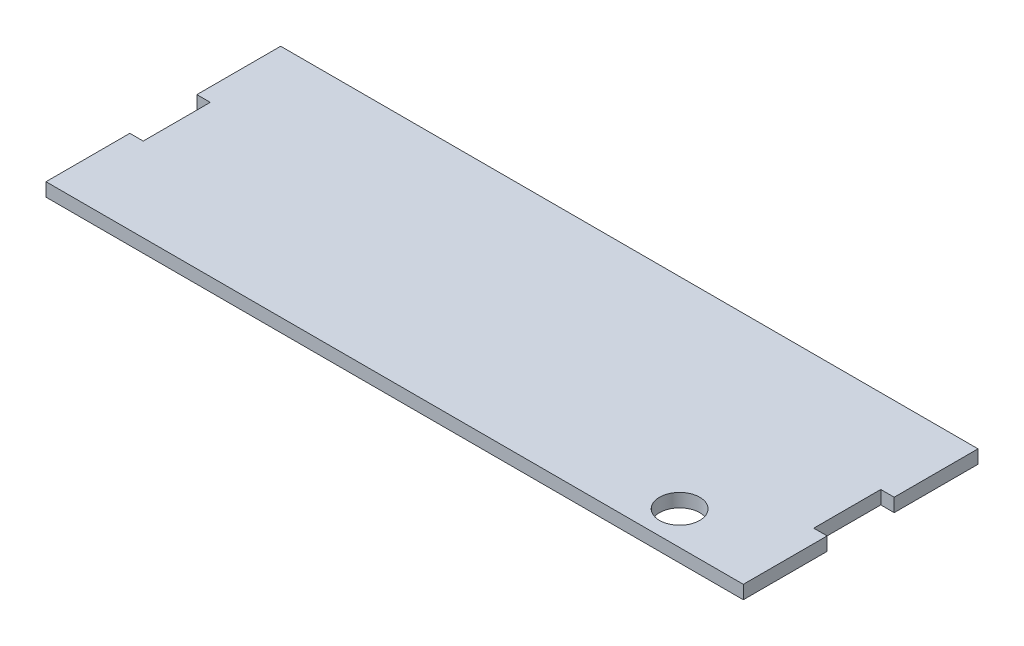
ISO-10303-21;
HEADER;
FILE_DESCRIPTION(('STEP AP214'),'2;1');
FILE_NAME('part.step','',(''),(''),'','','');
FILE_SCHEMA(('AUTOMOTIVE_DESIGN { 1 0 10303 214 1 1 1 1 }'));
ENDSEC;
DATA;
#1=APPLICATION_CONTEXT('core data for automotive mechanical design processes');
#2=APPLICATION_PROTOCOL_DEFINITION('international standard','automotive_design',2000,#1);
#3=PRODUCT_CONTEXT('',#1,'mechanical');
#4=PRODUCT('Part','Part','',(#3));
#5=PRODUCT_RELATED_PRODUCT_CATEGORY('part','',(#4));
#6=PRODUCT_DEFINITION_FORMATION('','',#4);
#7=PRODUCT_DEFINITION_CONTEXT('part definition',#1,'design');
#8=PRODUCT_DEFINITION('design','',#6,#7);
#9=PRODUCT_DEFINITION_SHAPE('','',#8);
#10=(LENGTH_UNIT() NAMED_UNIT(*) SI_UNIT(.MILLI.,.METRE.));
#11=(NAMED_UNIT(*) PLANE_ANGLE_UNIT() SI_UNIT($,.RADIAN.));
#12=(NAMED_UNIT(*) SI_UNIT($,.STERADIAN.) SOLID_ANGLE_UNIT());
#13=UNCERTAINTY_MEASURE_WITH_UNIT(LENGTH_MEASURE(1.E-05),#10,'distance_accuracy_value','');
#14=(GEOMETRIC_REPRESENTATION_CONTEXT(3) GLOBAL_UNCERTAINTY_ASSIGNED_CONTEXT((#13)) GLOBAL_UNIT_ASSIGNED_CONTEXT((#10,
#11,#12)) REPRESENTATION_CONTEXT('',''));
#15=CARTESIAN_POINT('',(0.,0.,0.));
#16=DIRECTION('',(0.,0.,1.));
#17=DIRECTION('',(1.,0.,0.));
#18=AXIS2_PLACEMENT_3D('',#15,#16,#17);
#19=CARTESIAN_POINT('',(-70.8435595970924,4.,0.));
#20=DIRECTION('',(0.,0.,-1.));
#21=DIRECTION('',(-1.,0.,0.));
#22=AXIS2_PLACEMENT_3D('',#19,#20,#21);
#23=PLANE('',#22);
#24=DIRECTION('',(1.,0.,0.));
#25=VECTOR('',#24,1.);
#26=CARTESIAN_POINT('',(-70.8435595970924,0.,0.));
#27=LINE('',#26,#25);
#28=CARTESIAN_POINT('',(-4.,0.,0.));
#29=VERTEX_POINT('',#28);
#30=CARTESIAN_POINT('',(204.,0.,0.));
#31=VERTEX_POINT('',#30);
#32=EDGE_CURVE('E160',#29,#31,#27,.T.);
#33=ORIENTED_EDGE('',*,*,#32,.T.);
#34=DIRECTION('',(0.,-1.,0.));
#35=VECTOR('',#34,1.);
#36=CARTESIAN_POINT('',(204.,4.,0.));
#37=LINE('',#36,#35);
#38=CARTESIAN_POINT('',(204.,4.,0.));
#39=VERTEX_POINT('',#38);
#40=EDGE_CURVE('E11',#39,#31,#37,.T.);
#41=ORIENTED_EDGE('',*,*,#40,.F.);
#42=DIRECTION('',(1.,0.,0.));
#43=VECTOR('',#42,1.);
#44=CARTESIAN_POINT('',(-70.8435595970924,4.,0.));
#45=LINE('',#44,#43);
#46=CARTESIAN_POINT('',(-4.,4.,0.));
#47=VERTEX_POINT('',#46);
#48=EDGE_CURVE('E426',#47,#39,#45,.T.);
#49=ORIENTED_EDGE('',*,*,#48,.F.);
#50=DIRECTION('',(0.,-1.,0.));
#51=VECTOR('',#50,1.);
#52=CARTESIAN_POINT('',(-4.,4.,0.));
#53=LINE('',#52,#51);
#54=EDGE_CURVE('E51',#47,#29,#53,.T.);
#55=ORIENTED_EDGE('',*,*,#54,.T.);
#56=EDGE_LOOP('',(#33,#41,#49,#55));
#57=FACE_BOUND('',#56,.T.);
#58=ADVANCED_FACE('F34',(#57),#23,.F.);
#59=CARTESIAN_POINT('',(204.,4.,-35.));
#60=DIRECTION('',(-1.,0.,0.));
#61=DIRECTION('',(0.,0.,1.));
#62=AXIS2_PLACEMENT_3D('',#59,#60,#61);
#63=PLANE('',#62);
#64=DIRECTION('',(0.,0.,-1.));
#65=VECTOR('',#64,1.);
#66=CARTESIAN_POINT('',(204.,0.,-35.));
#67=LINE('',#66,#65);
#68=CARTESIAN_POINT('',(204.,0.,-25.));
#69=VERTEX_POINT('',#68);
#70=EDGE_CURVE('E162',#31,#69,#67,.T.);
#71=ORIENTED_EDGE('',*,*,#70,.T.);
#72=DIRECTION('',(0.,-1.,0.));
#73=VECTOR('',#72,1.);
#74=CARTESIAN_POINT('',(204.,4.,-25.));
#75=LINE('',#74,#73);
#76=CARTESIAN_POINT('',(204.,4.,-25.));
#77=VERTEX_POINT('',#76);
#78=EDGE_CURVE('E43',#77,#69,#75,.T.);
#79=ORIENTED_EDGE('',*,*,#78,.F.);
#80=DIRECTION('',(0.,0.,-1.));
#81=VECTOR('',#80,1.);
#82=CARTESIAN_POINT('',(204.,4.,-35.));
#83=LINE('',#82,#81);
#84=EDGE_CURVE('E102',#39,#77,#83,.T.);
#85=ORIENTED_EDGE('',*,*,#84,.F.);
#86=ORIENTED_EDGE('',*,*,#40,.T.);
#87=EDGE_LOOP('',(#71,#79,#85,#86));
#88=FACE_BOUND('',#87,.T.);
#89=ADVANCED_FACE('F213',(#88),#63,.F.);
#90=CARTESIAN_POINT('',(-70.8435595970924,4.,-25.));
#91=DIRECTION('',(0.,0.,-1.));
#92=DIRECTION('',(-1.,0.,0.));
#93=AXIS2_PLACEMENT_3D('',#90,#91,#92);
#94=PLANE('',#93);
#95=DIRECTION('',(1.,0.,0.));
#96=VECTOR('',#95,1.);
#97=CARTESIAN_POINT('',(-70.8435595970924,0.,-25.));
#98=LINE('',#97,#96);
#99=CARTESIAN_POINT('',(200.,0.,-25.));
#100=VERTEX_POINT('',#99);
#101=EDGE_CURVE('E165',#100,#69,#98,.T.);
#102=ORIENTED_EDGE('',*,*,#101,.F.);
#103=DIRECTION('',(0.,-1.,0.));
#104=VECTOR('',#103,1.);
#105=CARTESIAN_POINT('',(200.,4.,-25.));
#106=LINE('',#105,#104);
#107=CARTESIAN_POINT('',(200.,4.,-25.));
#108=VERTEX_POINT('',#107);
#109=EDGE_CURVE('E206',#108,#100,#106,.T.);
#110=ORIENTED_EDGE('',*,*,#109,.F.);
#111=DIRECTION('',(1.,0.,0.));
#112=VECTOR('',#111,1.);
#113=CARTESIAN_POINT('',(-70.8435595970924,4.,-25.));
#114=LINE('',#113,#112);
#115=EDGE_CURVE('E212',#108,#77,#114,.T.);
#116=ORIENTED_EDGE('',*,*,#115,.T.);
#117=ORIENTED_EDGE('',*,*,#78,.T.);
#118=EDGE_LOOP('',(#102,#110,#116,#117));
#119=FACE_BOUND('',#118,.T.);
#120=ADVANCED_FACE('F210',(#119),#94,.T.);
#121=CARTESIAN_POINT('',(200.,4.,-35.));
#122=DIRECTION('',(-1.,0.,0.));
#123=DIRECTION('',(0.,0.,1.));
#124=AXIS2_PLACEMENT_3D('',#121,#122,#123);
#125=PLANE('',#124);
#126=DIRECTION('',(0.,0.,-1.));
#127=VECTOR('',#126,1.);
#128=CARTESIAN_POINT('',(200.,0.,-35.));
#129=LINE('',#128,#127);
#130=CARTESIAN_POINT('',(200.,0.,-45.));
#131=VERTEX_POINT('',#130);
#132=EDGE_CURVE('E168',#100,#131,#129,.T.);
#133=ORIENTED_EDGE('',*,*,#132,.T.);
#134=DIRECTION('',(0.,-1.,0.));
#135=VECTOR('',#134,1.);
#136=CARTESIAN_POINT('',(200.,4.,-45.));
#137=LINE('',#136,#135);
#138=CARTESIAN_POINT('',(200.,4.,-45.));
#139=VERTEX_POINT('',#138);
#140=EDGE_CURVE('E203',#139,#131,#137,.T.);
#141=ORIENTED_EDGE('',*,*,#140,.F.);
#142=DIRECTION('',(0.,0.,-1.));
#143=VECTOR('',#142,1.);
#144=CARTESIAN_POINT('',(200.,4.,-35.));
#145=LINE('',#144,#143);
#146=EDGE_CURVE('E231',#108,#139,#145,.T.);
#147=ORIENTED_EDGE('',*,*,#146,.F.);
#148=ORIENTED_EDGE('',*,*,#109,.T.);
#149=EDGE_LOOP('',(#133,#141,#147,#148));
#150=FACE_BOUND('',#149,.T.);
#151=ADVANCED_FACE('F221',(#150),#125,.F.);
#152=CARTESIAN_POINT('',(-70.8435595970924,4.,-45.));
#153=DIRECTION('',(0.,0.,-1.));
#154=DIRECTION('',(-1.,0.,0.));
#155=AXIS2_PLACEMENT_3D('',#152,#153,#154);
#156=PLANE('',#155);
#157=DIRECTION('',(1.,0.,0.));
#158=VECTOR('',#157,1.);
#159=CARTESIAN_POINT('',(-70.8435595970924,0.,-45.));
#160=LINE('',#159,#158);
#161=CARTESIAN_POINT('',(204.,0.,-45.));
#162=VERTEX_POINT('',#161);
#163=EDGE_CURVE('E170',#131,#162,#160,.T.);
#164=ORIENTED_EDGE('',*,*,#163,.T.);
#165=DIRECTION('',(0.,-1.,0.));
#166=VECTOR('',#165,1.);
#167=CARTESIAN_POINT('',(204.,4.,-45.));
#168=LINE('',#167,#166);
#169=CARTESIAN_POINT('',(204.,4.,-45.));
#170=VERTEX_POINT('',#169);
#171=EDGE_CURVE('E201',#170,#162,#168,.T.);
#172=ORIENTED_EDGE('',*,*,#171,.F.);
#173=DIRECTION('',(1.,0.,0.));
#174=VECTOR('',#173,1.);
#175=CARTESIAN_POINT('',(-70.8435595970924,4.,-45.));
#176=LINE('',#175,#174);
#177=EDGE_CURVE('E227',#139,#170,#176,.T.);
#178=ORIENTED_EDGE('',*,*,#177,.F.);
#179=ORIENTED_EDGE('',*,*,#140,.T.);
#180=EDGE_LOOP('',(#164,#172,#178,#179));
#181=FACE_BOUND('',#180,.T.);
#182=ADVANCED_FACE('F225',(#181),#156,.F.);
#183=CARTESIAN_POINT('',(204.,4.,-35.0000000000003));
#184=DIRECTION('',(1.,0.,0.));
#185=DIRECTION('',(0.,0.,-1.));
#186=AXIS2_PLACEMENT_3D('',#183,#184,#185);
#187=PLANE('',#186);
#188=DIRECTION('',(0.,0.,1.));
#189=VECTOR('',#188,1.);
#190=CARTESIAN_POINT('',(204.,0.,-35.0000000000003));
#191=LINE('',#190,#189);
#192=CARTESIAN_POINT('',(204.,0.,-70.));
#193=VERTEX_POINT('',#192);
#194=EDGE_CURVE('E173',#193,#162,#191,.T.);
#195=ORIENTED_EDGE('',*,*,#194,.F.);
#196=DIRECTION('',(0.,-1.,0.));
#197=VECTOR('',#196,1.);
#198=CARTESIAN_POINT('',(204.,4.,-70.));
#199=LINE('',#198,#197);
#200=CARTESIAN_POINT('',(204.,4.,-70.));
#201=VERTEX_POINT('',#200);
#202=EDGE_CURVE('E199',#201,#193,#199,.T.);
#203=ORIENTED_EDGE('',*,*,#202,.F.);
#204=DIRECTION('',(0.,0.,1.));
#205=VECTOR('',#204,1.);
#206=CARTESIAN_POINT('',(204.,4.,-35.0000000000003));
#207=LINE('',#206,#205);
#208=EDGE_CURVE('E230',#201,#170,#207,.T.);
#209=ORIENTED_EDGE('',*,*,#208,.T.);
#210=ORIENTED_EDGE('',*,*,#171,.T.);
#211=EDGE_LOOP('',(#195,#203,#209,#210));
#212=FACE_BOUND('',#211,.T.);
#213=ADVANCED_FACE('F272',(#212),#187,.T.);
#214=CARTESIAN_POINT('',(-70.8435595970924,4.,-70.));
#215=DIRECTION('',(0.,0.,-1.));
#216=DIRECTION('',(-1.,0.,0.));
#217=AXIS2_PLACEMENT_3D('',#214,#215,#216);
#218=PLANE('',#217);
#219=DIRECTION('',(1.,0.,0.));
#220=VECTOR('',#219,1.);
#221=CARTESIAN_POINT('',(-70.8435595970924,0.,-70.));
#222=LINE('',#221,#220);
#223=CARTESIAN_POINT('',(-4.,0.,-70.));
#224=VERTEX_POINT('',#223);
#225=EDGE_CURVE('E176',#224,#193,#222,.T.);
#226=ORIENTED_EDGE('',*,*,#225,.F.);
#227=DIRECTION('',(0.,-1.,0.));
#228=VECTOR('',#227,1.);
#229=CARTESIAN_POINT('',(-4.,4.,-70.));
#230=LINE('',#229,#228);
#231=CARTESIAN_POINT('',(-4.,4.,-70.));
#232=VERTEX_POINT('',#231);
#233=EDGE_CURVE('E197',#232,#224,#230,.T.);
#234=ORIENTED_EDGE('',*,*,#233,.F.);
#235=DIRECTION('',(1.,0.,0.));
#236=VECTOR('',#235,1.);
#237=CARTESIAN_POINT('',(-70.8435595970924,4.,-70.));
#238=LINE('',#237,#236);
#239=EDGE_CURVE('E233',#232,#201,#238,.T.);
#240=ORIENTED_EDGE('',*,*,#239,.T.);
#241=ORIENTED_EDGE('',*,*,#202,.T.);
#242=EDGE_LOOP('',(#226,#234,#240,#241));
#243=FACE_BOUND('',#242,.T.);
#244=ADVANCED_FACE('F275',(#243),#218,.T.);
#245=CARTESIAN_POINT('',(-4.,4.,-35.));
#246=DIRECTION('',(1.,0.,0.));
#247=DIRECTION('',(0.,0.,-1.));
#248=AXIS2_PLACEMENT_3D('',#245,#246,#247);
#249=PLANE('',#248);
#250=DIRECTION('',(0.,0.,1.));
#251=VECTOR('',#250,1.);
#252=CARTESIAN_POINT('',(-4.,0.,-35.));
#253=LINE('',#252,#251);
#254=CARTESIAN_POINT('',(-3.99999999999999,0.,-45.));
#255=VERTEX_POINT('',#254);
#256=EDGE_CURVE('E179',#224,#255,#253,.T.);
#257=ORIENTED_EDGE('',*,*,#256,.T.);
#258=DIRECTION('',(0.,-1.,0.));
#259=VECTOR('',#258,1.);
#260=CARTESIAN_POINT('',(-3.99999999999999,4.,-45.));
#261=LINE('',#260,#259);
#262=CARTESIAN_POINT('',(-3.99999999999999,4.,-45.));
#263=VERTEX_POINT('',#262);
#264=EDGE_CURVE('E195',#263,#255,#261,.T.);
#265=ORIENTED_EDGE('',*,*,#264,.F.);
#266=DIRECTION('',(0.,0.,1.));
#267=VECTOR('',#266,1.);
#268=CARTESIAN_POINT('',(-4.,4.,-35.));
#269=LINE('',#268,#267);
#270=EDGE_CURVE('E152',#232,#263,#269,.T.);
#271=ORIENTED_EDGE('',*,*,#270,.F.);
#272=ORIENTED_EDGE('',*,*,#233,.T.);
#273=EDGE_LOOP('',(#257,#265,#271,#272));
#274=FACE_BOUND('',#273,.T.);
#275=ADVANCED_FACE('F243',(#274),#249,.F.);
#276=CARTESIAN_POINT('',(-70.8435595970924,4.,-45.));
#277=DIRECTION('',(0.,0.,1.));
#278=DIRECTION('',(1.,0.,0.));
#279=AXIS2_PLACEMENT_3D('',#276,#277,#278);
#280=PLANE('',#279);
#281=DIRECTION('',(-1.,0.,0.));
#282=VECTOR('',#281,1.);
#283=CARTESIAN_POINT('',(-70.8435595970924,0.,-45.));
#284=LINE('',#283,#282);
#285=CARTESIAN_POINT('',(0.,0.,-45.));
#286=VERTEX_POINT('',#285);
#287=EDGE_CURVE('E182',#286,#255,#284,.T.);
#288=ORIENTED_EDGE('',*,*,#287,.F.);
#289=DIRECTION('',(0.,-1.,0.));
#290=VECTOR('',#289,1.);
#291=CARTESIAN_POINT('',(0.,4.,-45.));
#292=LINE('',#291,#290);
#293=CARTESIAN_POINT('',(0.,4.,-45.));
#294=VERTEX_POINT('',#293);
#295=EDGE_CURVE('E139',#294,#286,#292,.T.);
#296=ORIENTED_EDGE('',*,*,#295,.F.);
#297=DIRECTION('',(-1.,0.,0.));
#298=VECTOR('',#297,1.);
#299=CARTESIAN_POINT('',(-70.8435595970924,4.,-45.));
#300=LINE('',#299,#298);
#301=EDGE_CURVE('E150',#294,#263,#300,.T.);
#302=ORIENTED_EDGE('',*,*,#301,.T.);
#303=ORIENTED_EDGE('',*,*,#264,.T.);
#304=EDGE_LOOP('',(#288,#296,#302,#303));
#305=FACE_BOUND('',#304,.T.);
#306=ADVANCED_FACE('F247',(#305),#280,.T.);
#307=CARTESIAN_POINT('',(0.,4.,-35.));
#308=DIRECTION('',(-1.,0.,0.));
#309=DIRECTION('',(0.,0.,1.));
#310=AXIS2_PLACEMENT_3D('',#307,#308,#309);
#311=PLANE('',#310);
#312=DIRECTION('',(0.,0.,-1.));
#313=VECTOR('',#312,1.);
#314=CARTESIAN_POINT('',(0.,0.,-35.));
#315=LINE('',#314,#313);
#316=CARTESIAN_POINT('',(0.,0.,-25.));
#317=VERTEX_POINT('',#316);
#318=EDGE_CURVE('E136',#317,#286,#315,.T.);
#319=ORIENTED_EDGE('',*,*,#318,.F.);
#320=DIRECTION('',(0.,-1.,0.));
#321=VECTOR('',#320,1.);
#322=CARTESIAN_POINT('',(0.,4.,-25.));
#323=LINE('',#322,#321);
#324=CARTESIAN_POINT('',(0.,4.,-25.));
#325=VERTEX_POINT('',#324);
#326=EDGE_CURVE('E130',#325,#317,#323,.T.);
#327=ORIENTED_EDGE('',*,*,#326,.F.);
#328=DIRECTION('',(0.,0.,-1.));
#329=VECTOR('',#328,1.);
#330=CARTESIAN_POINT('',(0.,4.,-35.));
#331=LINE('',#330,#329);
#332=EDGE_CURVE('E134',#325,#294,#331,.T.);
#333=ORIENTED_EDGE('',*,*,#332,.T.);
#334=ORIENTED_EDGE('',*,*,#295,.T.);
#335=EDGE_LOOP('',(#319,#327,#333,#334));
#336=FACE_BOUND('',#335,.T.);
#337=ADVANCED_FACE('F132',(#336),#311,.T.);
#338=CARTESIAN_POINT('',(-70.8435595970924,4.,-25.));
#339=DIRECTION('',(0.,0.,1.));
#340=DIRECTION('',(1.,0.,0.));
#341=AXIS2_PLACEMENT_3D('',#338,#339,#340);
#342=PLANE('',#341);
#343=DIRECTION('',(-1.,0.,0.));
#344=VECTOR('',#343,1.);
#345=CARTESIAN_POINT('',(-70.8435595970924,0.,-25.));
#346=LINE('',#345,#344);
#347=CARTESIAN_POINT('',(-4.,0.,-25.));
#348=VERTEX_POINT('',#347);
#349=EDGE_CURVE('E186',#317,#348,#346,.T.);
#350=ORIENTED_EDGE('',*,*,#349,.T.);
#351=DIRECTION('',(0.,-1.,0.));
#352=VECTOR('',#351,1.);
#353=CARTESIAN_POINT('',(-4.,4.,-25.));
#354=LINE('',#353,#352);
#355=CARTESIAN_POINT('',(-4.,4.,-25.));
#356=VERTEX_POINT('',#355);
#357=EDGE_CURVE('E90',#356,#348,#354,.T.);
#358=ORIENTED_EDGE('',*,*,#357,.F.);
#359=DIRECTION('',(-1.,0.,0.));
#360=VECTOR('',#359,1.);
#361=CARTESIAN_POINT('',(-70.8435595970924,4.,-25.));
#362=LINE('',#361,#360);
#363=EDGE_CURVE('E141',#325,#356,#362,.T.);
#364=ORIENTED_EDGE('',*,*,#363,.F.);
#365=ORIENTED_EDGE('',*,*,#326,.T.);
#366=EDGE_LOOP('',(#350,#358,#364,#365));
#367=FACE_BOUND('',#366,.T.);
#368=ADVANCED_FACE('F142',(#367),#342,.F.);
#369=CARTESIAN_POINT('',(175.,4.,-10.));
#370=DIRECTION('',(0.,-1.,0.));
#371=DIRECTION('',(0.,0.,-1.));
#372=AXIS2_PLACEMENT_3D('',#369,#370,#371);
#373=CYLINDRICAL_SURFACE('',#372,6.00000000000002);
#374=CARTESIAN_POINT('',(175.,4.,-10.));
#375=DIRECTION('',(0.,1.,0.));
#376=DIRECTION('',(0.,0.,1.));
#377=AXIS2_PLACEMENT_3D('',#374,#375,#376);
#378=CIRCLE('',#377,6.00000000000002);
#379=CARTESIAN_POINT('',(175.,4.,-3.99999999999998));
#380=VERTEX_POINT('',#379);
#381=EDGE_CURVE('E191',#380,#380,#378,.T.);
#382=ORIENTED_EDGE('',*,*,#381,.T.);
#383=EDGE_LOOP('',(#382));
#384=FACE_BOUND('',#383,.T.);
#385=CARTESIAN_POINT('',(175.,0.,-10.));
#386=DIRECTION('',(0.,1.,0.));
#387=DIRECTION('',(0.,0.,1.));
#388=AXIS2_PLACEMENT_3D('',#385,#386,#387);
#389=CIRCLE('',#388,6.00000000000002);
#390=CARTESIAN_POINT('',(175.,0.,-3.99999999999998));
#391=VERTEX_POINT('',#390);
#392=EDGE_CURVE('E157',#391,#391,#389,.T.);
#393=ORIENTED_EDGE('',*,*,#392,.F.);
#394=EDGE_LOOP('',(#393));
#395=FACE_BOUND('',#394,.T.);
#396=ADVANCED_FACE('F36',(#384,#395),#373,.F.);
#397=CARTESIAN_POINT('',(-4.,4.,-35.));
#398=DIRECTION('',(-1.,0.,0.));
#399=DIRECTION('',(0.,0.,1.));
#400=AXIS2_PLACEMENT_3D('',#397,#398,#399);
#401=PLANE('',#400);
#402=DIRECTION('',(0.,0.,-1.));
#403=VECTOR('',#402,1.);
#404=CARTESIAN_POINT('',(-4.,0.,-35.));
#405=LINE('',#404,#403);
#406=EDGE_CURVE('E188',#29,#348,#405,.T.);
#407=ORIENTED_EDGE('',*,*,#406,.F.);
#408=ORIENTED_EDGE('',*,*,#54,.F.);
#409=DIRECTION('',(0.,0.,-1.));
#410=VECTOR('',#409,1.);
#411=CARTESIAN_POINT('',(-4.,4.,-35.));
#412=LINE('',#411,#410);
#413=EDGE_CURVE('E145',#47,#356,#412,.T.);
#414=ORIENTED_EDGE('',*,*,#413,.T.);
#415=ORIENTED_EDGE('',*,*,#357,.T.);
#416=EDGE_LOOP('',(#407,#408,#414,#415));
#417=FACE_BOUND('',#416,.T.);
#418=ADVANCED_FACE('F248',(#417),#401,.T.);
#419=CARTESIAN_POINT('',(-70.8435595970924,4.,-35.));
#420=DIRECTION('',(0.,1.,0.));
#421=DIRECTION('',(0.,0.,1.));
#422=AXIS2_PLACEMENT_3D('',#419,#420,#421);
#423=PLANE('',#422);
#424=ORIENTED_EDGE('',*,*,#381,.F.);
#425=EDGE_LOOP('',(#424));
#426=FACE_BOUND('',#425,.T.);
#427=ORIENTED_EDGE('',*,*,#48,.T.);
#428=ORIENTED_EDGE('',*,*,#84,.T.);
#429=ORIENTED_EDGE('',*,*,#115,.F.);
#430=ORIENTED_EDGE('',*,*,#146,.T.);
#431=ORIENTED_EDGE('',*,*,#177,.T.);
#432=ORIENTED_EDGE('',*,*,#208,.F.);
#433=ORIENTED_EDGE('',*,*,#239,.F.);
#434=ORIENTED_EDGE('',*,*,#270,.T.);
#435=ORIENTED_EDGE('',*,*,#301,.F.);
#436=ORIENTED_EDGE('',*,*,#332,.F.);
#437=ORIENTED_EDGE('',*,*,#363,.T.);
#438=ORIENTED_EDGE('',*,*,#413,.F.);
#439=EDGE_LOOP('',(#427,#428,#429,#430,#431,#432,#433,#434,#435,#436,#437,#438));
#440=FACE_BOUND('',#439,.T.);
#441=ADVANCED_FACE('F148',(#426,#440),#423,.T.);
#442=CARTESIAN_POINT('',(-70.8435595970924,0.,-35.));
#443=DIRECTION('',(0.,1.,0.));
#444=DIRECTION('',(0.,0.,1.));
#445=AXIS2_PLACEMENT_3D('',#442,#443,#444);
#446=PLANE('',#445);
#447=ORIENTED_EDGE('',*,*,#392,.T.);
#448=EDGE_LOOP('',(#447));
#449=FACE_BOUND('',#448,.T.);
#450=ORIENTED_EDGE('',*,*,#32,.F.);
#451=ORIENTED_EDGE('',*,*,#406,.T.);
#452=ORIENTED_EDGE('',*,*,#349,.F.);
#453=ORIENTED_EDGE('',*,*,#318,.T.);
#454=ORIENTED_EDGE('',*,*,#287,.T.);
#455=ORIENTED_EDGE('',*,*,#256,.F.);
#456=ORIENTED_EDGE('',*,*,#225,.T.);
#457=ORIENTED_EDGE('',*,*,#194,.T.);
#458=ORIENTED_EDGE('',*,*,#163,.F.);
#459=ORIENTED_EDGE('',*,*,#132,.F.);
#460=ORIENTED_EDGE('',*,*,#101,.T.);
#461=ORIENTED_EDGE('',*,*,#70,.F.);
#462=EDGE_LOOP('',(#450,#451,#452,#453,#454,#455,#456,#457,#458,#459,#460,#461));
#463=FACE_BOUND('',#462,.T.);
#464=ADVANCED_FACE('F217',(#449,#463),#446,.F.);
#465=CLOSED_SHELL('',(#58,#89,#120,#151,#182,#213,#244,#275,#306,#337,#368,#396,#418,#441,#464));
#466=MANIFOLD_SOLID_BREP('B2',#465);
#467=ADVANCED_BREP_SHAPE_REPRESENTATION('',(#18,#466),#14);
#468=SHAPE_DEFINITION_REPRESENTATION(#9,#467);
ENDSEC;
END-ISO-10303-21;
